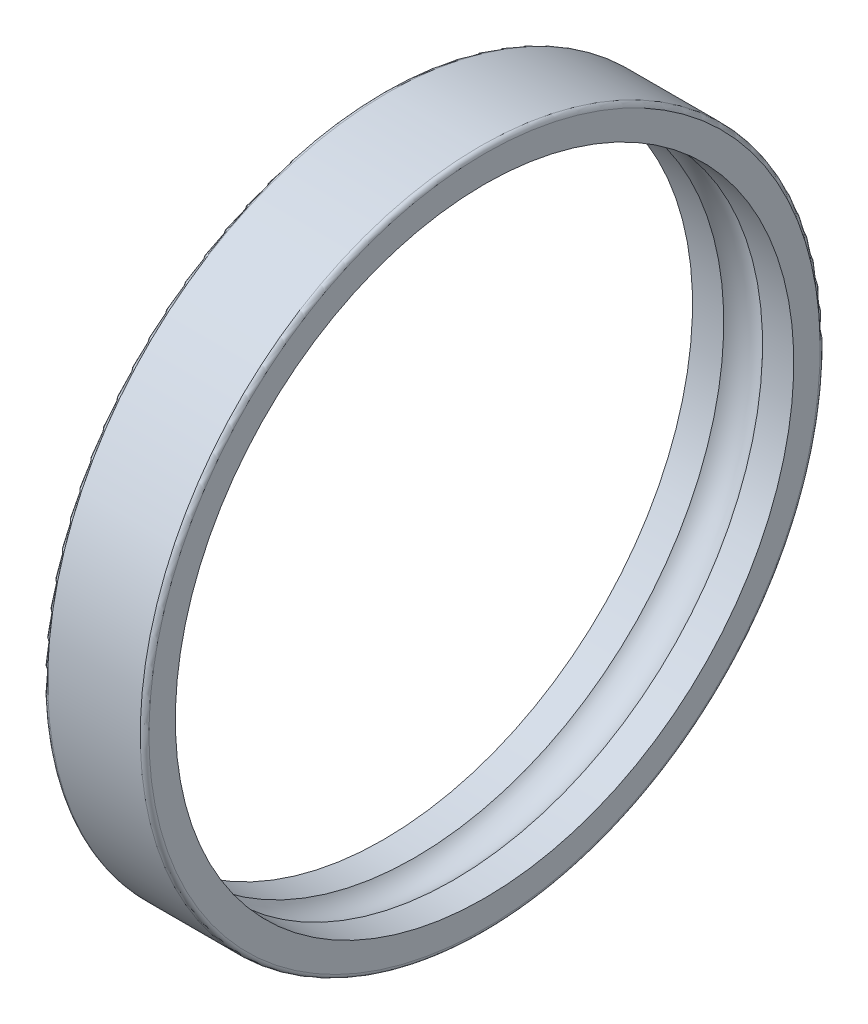
ISO-10303-21;
HEADER;
FILE_DESCRIPTION(('STEP AP214'),'2;1');
FILE_NAME('part.step','',(''),(''),'','','');
FILE_SCHEMA(('AUTOMOTIVE_DESIGN { 1 0 10303 214 1 1 1 1 }'));
ENDSEC;
DATA;
#1=APPLICATION_CONTEXT('core data for automotive mechanical design processes');
#2=APPLICATION_PROTOCOL_DEFINITION('international standard','automotive_design',2000,#1);
#3=PRODUCT_CONTEXT('',#1,'mechanical');
#4=PRODUCT('Part','Part','',(#3));
#5=PRODUCT_RELATED_PRODUCT_CATEGORY('part','',(#4));
#6=PRODUCT_DEFINITION_FORMATION('','',#4);
#7=PRODUCT_DEFINITION_CONTEXT('part definition',#1,'design');
#8=PRODUCT_DEFINITION('design','',#6,#7);
#9=PRODUCT_DEFINITION_SHAPE('','',#8);
#10=(LENGTH_UNIT() NAMED_UNIT(*) SI_UNIT(.MILLI.,.METRE.));
#11=(NAMED_UNIT(*) PLANE_ANGLE_UNIT() SI_UNIT($,.RADIAN.));
#12=(NAMED_UNIT(*) SI_UNIT($,.STERADIAN.) SOLID_ANGLE_UNIT());
#13=UNCERTAINTY_MEASURE_WITH_UNIT(LENGTH_MEASURE(1.E-05),#10,'distance_accuracy_value','');
#14=(GEOMETRIC_REPRESENTATION_CONTEXT(3) GLOBAL_UNCERTAINTY_ASSIGNED_CONTEXT((#13)) GLOBAL_UNIT_ASSIGNED_CONTEXT((#10,
#11,#12)) REPRESENTATION_CONTEXT('',''));
#15=CARTESIAN_POINT('',(0.,0.,0.));
#16=DIRECTION('',(0.,0.,1.));
#17=DIRECTION('',(1.,0.,0.));
#18=AXIS2_PLACEMENT_3D('',#15,#16,#17);
#19=CARTESIAN_POINT('',(5.92023783092272,0.,0.));
#20=DIRECTION('',(-1.,0.,0.));
#21=DIRECTION('',(0.,1.,0.));
#22=AXIS2_PLACEMENT_3D('',#19,#20,#21);
#23=CYLINDRICAL_SURFACE('',#22,21.375);
#24=CARTESIAN_POINT('',(7.,0.,0.));
#25=DIRECTION('',(1.,0.,0.));
#26=DIRECTION('',(0.,1.,0.));
#27=AXIS2_PLACEMENT_3D('',#24,#25,#26);
#28=CIRCLE('',#27,21.375);
#29=CARTESIAN_POINT('',(7.,21.375,0.));
#30=VERTEX_POINT('',#29);
#31=EDGE_CURVE('E11',#30,#30,#28,.T.);
#32=ORIENTED_EDGE('',*,*,#31,.T.);
#33=EDGE_LOOP('',(#32));
#34=FACE_BOUND('',#33,.T.);
#35=CARTESIAN_POINT('',(4.84047566184543,0.,0.));
#36=DIRECTION('',(1.,0.,0.));
#37=DIRECTION('',(0.,1.,0.));
#38=AXIS2_PLACEMENT_3D('',#35,#36,#37);
#39=CIRCLE('',#38,21.375);
#40=CARTESIAN_POINT('',(4.84047566184543,21.375,0.));
#41=VERTEX_POINT('',#40);
#42=EDGE_CURVE('E62',#41,#41,#39,.T.);
#43=ORIENTED_EDGE('',*,*,#42,.F.);
#44=EDGE_LOOP('',(#43));
#45=FACE_BOUND('',#44,.T.);
#46=ADVANCED_FACE('F16',(#34,#45),#23,.F.);
#47=CARTESIAN_POINT('',(7.,22.2875,0.));
#48=DIRECTION('',(1.,0.,0.));
#49=DIRECTION('',(0.,1.,0.));
#50=AXIS2_PLACEMENT_3D('',#47,#48,#49);
#51=PLANE('',#50);
#52=CARTESIAN_POINT('',(7.,0.,0.));
#53=DIRECTION('',(1.,0.,0.));
#54=DIRECTION('',(0.,1.,0.));
#55=AXIS2_PLACEMENT_3D('',#52,#53,#54);
#56=CIRCLE('',#55,23.2);
#57=CARTESIAN_POINT('',(7.,23.2,0.));
#58=VERTEX_POINT('',#57);
#59=EDGE_CURVE('E25',#58,#58,#56,.T.);
#60=ORIENTED_EDGE('',*,*,#59,.T.);
#61=EDGE_LOOP('',(#60));
#62=FACE_BOUND('',#61,.T.);
#63=ORIENTED_EDGE('',*,*,#31,.F.);
#64=EDGE_LOOP('',(#63));
#65=FACE_BOUND('',#64,.T.);
#66=ADVANCED_FACE('F87',(#62,#65),#51,.T.);
#67=CARTESIAN_POINT('',(6.7,0.,0.));
#68=DIRECTION('',(1.,0.,0.));
#69=DIRECTION('',(0.,0.,-1.));
#70=AXIS2_PLACEMENT_3D('',#67,#68,#69);
#71=TOROIDAL_SURFACE('',#70,23.2,0.3);
#72=CARTESIAN_POINT('',(6.7,0.,0.));
#73=DIRECTION('',(1.,0.,0.));
#74=DIRECTION('',(0.,1.,0.));
#75=AXIS2_PLACEMENT_3D('',#72,#73,#74);
#76=CIRCLE('',#75,23.5);
#77=CARTESIAN_POINT('',(6.7,23.5,0.));
#78=VERTEX_POINT('',#77);
#79=EDGE_CURVE('E49',#78,#78,#76,.T.);
#80=ORIENTED_EDGE('',*,*,#79,.T.);
#81=EDGE_LOOP('',(#80));
#82=FACE_BOUND('',#81,.T.);
#83=ORIENTED_EDGE('',*,*,#59,.F.);
#84=EDGE_LOOP('',(#83));
#85=FACE_BOUND('',#84,.T.);
#86=ADVANCED_FACE('F91',(#82,#85),#71,.T.);
#87=CARTESIAN_POINT('',(3.5,0.,0.));
#88=DIRECTION('',(-1.,0.,0.));
#89=DIRECTION('',(0.,1.,0.));
#90=AXIS2_PLACEMENT_3D('',#87,#88,#89);
#91=CYLINDRICAL_SURFACE('',#90,23.5);
#92=CARTESIAN_POINT('',(0.3,0.,0.));
#93=DIRECTION('',(1.,0.,0.));
#94=DIRECTION('',(0.,1.,0.));
#95=AXIS2_PLACEMENT_3D('',#92,#93,#94);
#96=CIRCLE('',#95,23.5);
#97=CARTESIAN_POINT('',(0.3,23.5,0.));
#98=VERTEX_POINT('',#97);
#99=EDGE_CURVE('E53',#98,#98,#96,.T.);
#100=ORIENTED_EDGE('',*,*,#99,.T.);
#101=EDGE_LOOP('',(#100));
#102=FACE_BOUND('',#101,.T.);
#103=ORIENTED_EDGE('',*,*,#79,.F.);
#104=EDGE_LOOP('',(#103));
#105=FACE_BOUND('',#104,.T.);
#106=ADVANCED_FACE('F54',(#102,#105),#91,.T.);
#107=CARTESIAN_POINT('',(0.3,0.,0.));
#108=DIRECTION('',(1.,0.,0.));
#109=DIRECTION('',(0.,0.,-1.));
#110=AXIS2_PLACEMENT_3D('',#107,#108,#109);
#111=TOROIDAL_SURFACE('',#110,23.2,0.3);
#112=CARTESIAN_POINT('',(0.,0.,0.));
#113=DIRECTION('',(1.,0.,0.));
#114=DIRECTION('',(0.,1.,0.));
#115=AXIS2_PLACEMENT_3D('',#112,#113,#114);
#116=CIRCLE('',#115,23.2);
#117=CARTESIAN_POINT('',(0.,23.2,0.));
#118=VERTEX_POINT('',#117);
#119=EDGE_CURVE('E19',#118,#118,#116,.T.);
#120=ORIENTED_EDGE('',*,*,#119,.T.);
#121=EDGE_LOOP('',(#120));
#122=FACE_BOUND('',#121,.T.);
#123=ORIENTED_EDGE('',*,*,#99,.F.);
#124=EDGE_LOOP('',(#123));
#125=FACE_BOUND('',#124,.T.);
#126=ADVANCED_FACE('F82',(#122,#125),#111,.T.);
#127=CARTESIAN_POINT('',(0.,22.2875,0.));
#128=DIRECTION('',(-1.,0.,0.));
#129=DIRECTION('',(0.,-1.,0.));
#130=AXIS2_PLACEMENT_3D('',#127,#128,#129);
#131=PLANE('',#130);
#132=CARTESIAN_POINT('',(0.,0.,0.));
#133=DIRECTION('',(1.,0.,0.));
#134=DIRECTION('',(0.,1.,0.));
#135=AXIS2_PLACEMENT_3D('',#132,#133,#134);
#136=CIRCLE('',#135,21.375);
#137=CARTESIAN_POINT('',(0.,21.375,0.));
#138=VERTEX_POINT('',#137);
#139=EDGE_CURVE('E59',#138,#138,#136,.T.);
#140=ORIENTED_EDGE('',*,*,#139,.T.);
#141=EDGE_LOOP('',(#140));
#142=FACE_BOUND('',#141,.T.);
#143=ORIENTED_EDGE('',*,*,#119,.F.);
#144=EDGE_LOOP('',(#143));
#145=FACE_BOUND('',#144,.T.);
#146=ADVANCED_FACE('F67',(#142,#145),#131,.T.);
#147=CARTESIAN_POINT('',(1.07976216907728,0.,0.));
#148=DIRECTION('',(-1.,0.,0.));
#149=DIRECTION('',(0.,1.,0.));
#150=AXIS2_PLACEMENT_3D('',#147,#148,#149);
#151=CYLINDRICAL_SURFACE('',#150,21.375);
#152=CARTESIAN_POINT('',(2.15952433815456,0.,0.));
#153=DIRECTION('',(1.,0.,0.));
#154=DIRECTION('',(0.,1.,0.));
#155=AXIS2_PLACEMENT_3D('',#152,#153,#154);
#156=CIRCLE('',#155,21.375);
#157=CARTESIAN_POINT('',(2.15952433815456,21.375,0.));
#158=VERTEX_POINT('',#157);
#159=EDGE_CURVE('E61',#158,#158,#156,.T.);
#160=ORIENTED_EDGE('',*,*,#159,.T.);
#161=EDGE_LOOP('',(#160));
#162=FACE_BOUND('',#161,.T.);
#163=ORIENTED_EDGE('',*,*,#139,.F.);
#164=EDGE_LOOP('',(#163));
#165=FACE_BOUND('',#164,.T.);
#166=ADVANCED_FACE('F70',(#162,#165),#151,.F.);
#167=CARTESIAN_POINT('',(3.5,0.,0.));
#168=DIRECTION('',(1.,0.,0.));
#169=DIRECTION('',(0.,0.,-1.));
#170=AXIS2_PLACEMENT_3D('',#167,#168,#169);
#171=TOROIDAL_SURFACE('',#170,20.25,1.75);
#172=ORIENTED_EDGE('',*,*,#42,.T.);
#173=EDGE_LOOP('',(#172));
#174=FACE_BOUND('',#173,.T.);
#175=ORIENTED_EDGE('',*,*,#159,.F.);
#176=EDGE_LOOP('',(#175));
#177=FACE_BOUND('',#176,.T.);
#178=ADVANCED_FACE('F72',(#174,#177),#171,.F.);
#179=CLOSED_SHELL('',(#46,#66,#86,#106,#126,#146,#166,#178));
#180=MANIFOLD_SOLID_BREP('B1',#179);
#181=ADVANCED_BREP_SHAPE_REPRESENTATION('',(#18,#180),#14);
#182=SHAPE_DEFINITION_REPRESENTATION(#9,#181);
ENDSEC;
END-ISO-10303-21;
